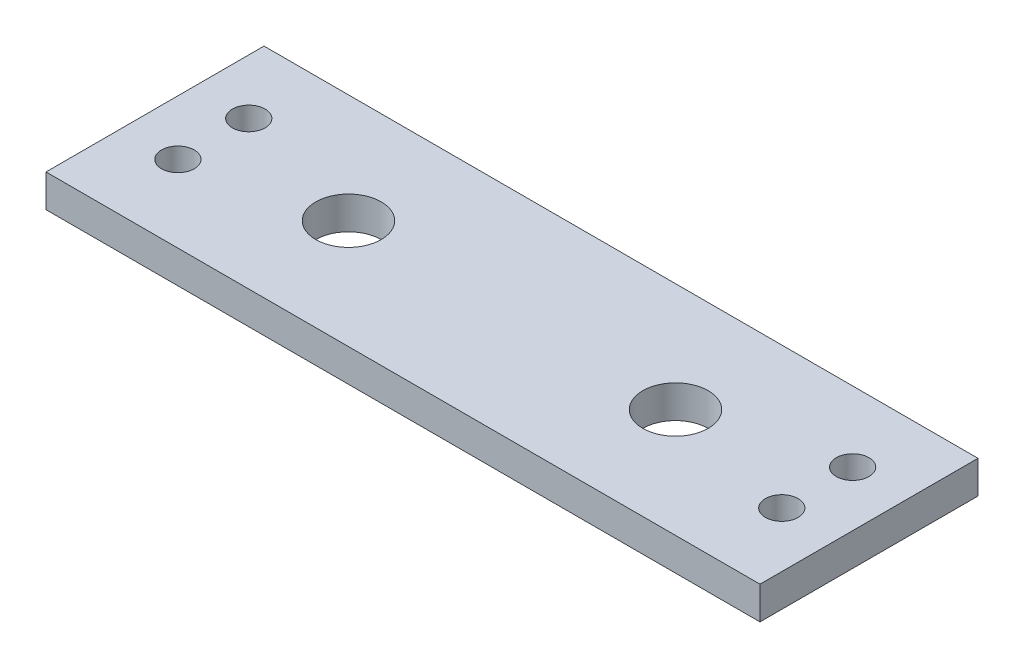
ISO-10303-21;
HEADER;
FILE_DESCRIPTION(('STEP AP214'),'2;1');
FILE_NAME('part.step','',(''),(''),'','','');
FILE_SCHEMA(('AUTOMOTIVE_DESIGN { 1 0 10303 214 1 1 1 1 }'));
ENDSEC;
DATA;
#1=APPLICATION_CONTEXT('core data for automotive mechanical design processes');
#2=APPLICATION_PROTOCOL_DEFINITION('international standard','automotive_design',2000,#1);
#3=PRODUCT_CONTEXT('',#1,'mechanical');
#4=PRODUCT('Part','Part','',(#3));
#5=PRODUCT_RELATED_PRODUCT_CATEGORY('part','',(#4));
#6=PRODUCT_DEFINITION_FORMATION('','',#4);
#7=PRODUCT_DEFINITION_CONTEXT('part definition',#1,'design');
#8=PRODUCT_DEFINITION('design','',#6,#7);
#9=PRODUCT_DEFINITION_SHAPE('','',#8);
#10=(LENGTH_UNIT() NAMED_UNIT(*) SI_UNIT(.MILLI.,.METRE.));
#11=(NAMED_UNIT(*) PLANE_ANGLE_UNIT() SI_UNIT($,.RADIAN.));
#12=(NAMED_UNIT(*) SI_UNIT($,.STERADIAN.) SOLID_ANGLE_UNIT());
#13=UNCERTAINTY_MEASURE_WITH_UNIT(LENGTH_MEASURE(1.E-05),#10,'distance_accuracy_value','');
#14=(GEOMETRIC_REPRESENTATION_CONTEXT(3) GLOBAL_UNCERTAINTY_ASSIGNED_CONTEXT((#13)) GLOBAL_UNIT_ASSIGNED_CONTEXT((#10,
#11,#12)) REPRESENTATION_CONTEXT('',''));
#15=CARTESIAN_POINT('',(0.,0.,0.));
#16=DIRECTION('',(0.,0.,1.));
#17=DIRECTION('',(1.,0.,0.));
#18=AXIS2_PLACEMENT_3D('',#15,#16,#17);
#19=CARTESIAN_POINT('',(0.,3.,0.));
#20=DIRECTION('',(1.,0.,0.));
#21=DIRECTION('',(0.,0.,-1.));
#22=AXIS2_PLACEMENT_3D('',#19,#20,#21);
#23=PLANE('',#22);
#24=DIRECTION('',(0.,0.,1.));
#25=VECTOR('',#24,1.);
#26=CARTESIAN_POINT('',(0.,0.,0.));
#27=LINE('',#26,#25);
#28=CARTESIAN_POINT('',(0.,0.,-20.));
#29=VERTEX_POINT('',#28);
#30=CARTESIAN_POINT('',(0.,0.,0.));
#31=VERTEX_POINT('',#30);
#32=EDGE_CURVE('E96',#29,#31,#27,.T.);
#33=ORIENTED_EDGE('',*,*,#32,.T.);
#34=DIRECTION('',(0.,-1.,0.));
#35=VECTOR('',#34,1.);
#36=CARTESIAN_POINT('',(0.,3.,0.));
#37=LINE('',#36,#35);
#38=CARTESIAN_POINT('',(0.,3.,0.));
#39=VERTEX_POINT('',#38);
#40=EDGE_CURVE('E11',#39,#31,#37,.T.);
#41=ORIENTED_EDGE('',*,*,#40,.F.);
#42=DIRECTION('',(0.,0.,1.));
#43=VECTOR('',#42,1.);
#44=CARTESIAN_POINT('',(0.,3.,0.));
#45=LINE('',#44,#43);
#46=CARTESIAN_POINT('',(0.,3.,-20.));
#47=VERTEX_POINT('',#46);
#48=EDGE_CURVE('E84',#47,#39,#45,.T.);
#49=ORIENTED_EDGE('',*,*,#48,.F.);
#50=DIRECTION('',(0.,-1.,0.));
#51=VECTOR('',#50,1.);
#52=CARTESIAN_POINT('',(0.,3.,-20.));
#53=LINE('',#52,#51);
#54=EDGE_CURVE('E92',#47,#29,#53,.T.);
#55=ORIENTED_EDGE('',*,*,#54,.T.);
#56=EDGE_LOOP('',(#33,#41,#49,#55));
#57=FACE_BOUND('',#56,.T.);
#58=ADVANCED_FACE('F33',(#57),#23,.F.);
#59=CARTESIAN_POINT('',(0.,3.,0.));
#60=DIRECTION('',(0.,0.,-1.));
#61=DIRECTION('',(-1.,0.,0.));
#62=AXIS2_PLACEMENT_3D('',#59,#60,#61);
#63=PLANE('',#62);
#64=DIRECTION('',(1.,0.,0.));
#65=VECTOR('',#64,1.);
#66=CARTESIAN_POINT('',(0.,0.,0.));
#67=LINE('',#66,#65);
#68=CARTESIAN_POINT('',(65.5,0.,0.));
#69=VERTEX_POINT('',#68);
#70=EDGE_CURVE('E88',#31,#69,#67,.T.);
#71=ORIENTED_EDGE('',*,*,#70,.T.);
#72=DIRECTION('',(0.,-1.,0.));
#73=VECTOR('',#72,1.);
#74=CARTESIAN_POINT('',(65.5,3.,0.));
#75=LINE('',#74,#73);
#76=CARTESIAN_POINT('',(65.5,3.,0.));
#77=VERTEX_POINT('',#76);
#78=EDGE_CURVE('E41',#77,#69,#75,.T.);
#79=ORIENTED_EDGE('',*,*,#78,.F.);
#80=DIRECTION('',(1.,0.,0.));
#81=VECTOR('',#80,1.);
#82=CARTESIAN_POINT('',(0.,3.,0.));
#83=LINE('',#82,#81);
#84=EDGE_CURVE('E79',#39,#77,#83,.T.);
#85=ORIENTED_EDGE('',*,*,#84,.F.);
#86=ORIENTED_EDGE('',*,*,#40,.T.);
#87=EDGE_LOOP('',(#71,#79,#85,#86));
#88=FACE_BOUND('',#87,.T.);
#89=ADVANCED_FACE('F87',(#88),#63,.F.);
#90=CARTESIAN_POINT('',(65.5,3.,0.));
#91=DIRECTION('',(-1.,0.,0.));
#92=DIRECTION('',(0.,0.,1.));
#93=AXIS2_PLACEMENT_3D('',#90,#91,#92);
#94=PLANE('',#93);
#95=DIRECTION('',(0.,0.,-1.));
#96=VECTOR('',#95,1.);
#97=CARTESIAN_POINT('',(65.5,0.,0.));
#98=LINE('',#97,#96);
#99=CARTESIAN_POINT('',(65.5,0.,-20.));
#100=VERTEX_POINT('',#99);
#101=EDGE_CURVE('E66',#69,#100,#98,.T.);
#102=ORIENTED_EDGE('',*,*,#101,.T.);
#103=DIRECTION('',(0.,-1.,0.));
#104=VECTOR('',#103,1.);
#105=CARTESIAN_POINT('',(65.5,3.,-20.));
#106=LINE('',#105,#104);
#107=CARTESIAN_POINT('',(65.5,3.,-20.));
#108=VERTEX_POINT('',#107);
#109=EDGE_CURVE('E89',#108,#100,#106,.T.);
#110=ORIENTED_EDGE('',*,*,#109,.F.);
#111=DIRECTION('',(0.,0.,-1.));
#112=VECTOR('',#111,1.);
#113=CARTESIAN_POINT('',(65.5,3.,0.));
#114=LINE('',#113,#112);
#115=EDGE_CURVE('E82',#77,#108,#114,.T.);
#116=ORIENTED_EDGE('',*,*,#115,.F.);
#117=ORIENTED_EDGE('',*,*,#78,.T.);
#118=EDGE_LOOP('',(#102,#110,#116,#117));
#119=FACE_BOUND('',#118,.T.);
#120=ADVANCED_FACE('F90',(#119),#94,.F.);
#121=CARTESIAN_POINT('',(0.,3.,-20.));
#122=DIRECTION('',(0.,0.,1.));
#123=DIRECTION('',(1.,0.,0.));
#124=AXIS2_PLACEMENT_3D('',#121,#122,#123);
#125=PLANE('',#124);
#126=DIRECTION('',(-1.,0.,0.));
#127=VECTOR('',#126,1.);
#128=CARTESIAN_POINT('',(0.,0.,-20.));
#129=LINE('',#128,#127);
#130=EDGE_CURVE('E72',#100,#29,#129,.T.);
#131=ORIENTED_EDGE('',*,*,#130,.T.);
#132=ORIENTED_EDGE('',*,*,#54,.F.);
#133=DIRECTION('',(-1.,0.,0.));
#134=VECTOR('',#133,1.);
#135=CARTESIAN_POINT('',(0.,3.,-20.));
#136=LINE('',#135,#134);
#137=EDGE_CURVE('E49',#108,#47,#136,.T.);
#138=ORIENTED_EDGE('',*,*,#137,.F.);
#139=ORIENTED_EDGE('',*,*,#109,.T.);
#140=EDGE_LOOP('',(#131,#132,#138,#139));
#141=FACE_BOUND('',#140,.T.);
#142=ADVANCED_FACE('F104',(#141),#125,.F.);
#143=CARTESIAN_POINT('',(0.,3.,0.));
#144=DIRECTION('',(0.,-1.,0.));
#145=DIRECTION('',(0.,0.,-1.));
#146=AXIS2_PLACEMENT_3D('',#143,#144,#145);
#147=PLANE('',#146);
#148=CARTESIAN_POINT('',(17.75,3.,-9.99999999999998));
#149=DIRECTION('',(0.,1.,0.));
#150=DIRECTION('',(0.,0.,1.));
#151=AXIS2_PLACEMENT_3D('',#148,#149,#150);
#152=CIRCLE('',#151,3.);
#153=CARTESIAN_POINT('',(17.75,3.,-6.99999999999998));
#154=VERTEX_POINT('',#153);
#155=EDGE_CURVE('E128',#154,#154,#152,.T.);
#156=ORIENTED_EDGE('',*,*,#155,.F.);
#157=EDGE_LOOP('',(#156));
#158=FACE_BOUND('',#157,.T.);
#159=CARTESIAN_POINT('',(5.05,3.,-7.05000000000012));
#160=DIRECTION('',(0.,1.,0.));
#161=DIRECTION('',(0.,0.,1.));
#162=AXIS2_PLACEMENT_3D('',#159,#160,#161);
#163=CIRCLE('',#162,1.5);
#164=CARTESIAN_POINT('',(5.05,3.,-5.55000000000012));
#165=VERTEX_POINT('',#164);
#166=EDGE_CURVE('E135',#165,#165,#163,.T.);
#167=ORIENTED_EDGE('',*,*,#166,.F.);
#168=EDGE_LOOP('',(#167));
#169=FACE_BOUND('',#168,.T.);
#170=CARTESIAN_POINT('',(5.05,3.,-13.5500000000001));
#171=DIRECTION('',(0.,1.,0.));
#172=DIRECTION('',(0.,0.,1.));
#173=AXIS2_PLACEMENT_3D('',#170,#171,#172);
#174=CIRCLE('',#173,1.5);
#175=CARTESIAN_POINT('',(5.05,3.,-12.0500000000001));
#176=VERTEX_POINT('',#175);
#177=EDGE_CURVE('E116',#176,#176,#174,.T.);
#178=ORIENTED_EDGE('',*,*,#177,.F.);
#179=EDGE_LOOP('',(#178));
#180=FACE_BOUND('',#179,.T.);
#181=CARTESIAN_POINT('',(60.45,3.,-7.05000000000012));
#182=DIRECTION('',(0.,1.,0.));
#183=DIRECTION('',(0.,0.,1.));
#184=AXIS2_PLACEMENT_3D('',#181,#182,#183);
#185=CIRCLE('',#184,1.50122028163598);
#186=CARTESIAN_POINT('',(60.45,3.,-5.54877971836414));
#187=VERTEX_POINT('',#186);
#188=EDGE_CURVE('E123',#187,#187,#185,.T.);
#189=ORIENTED_EDGE('',*,*,#188,.F.);
#190=EDGE_LOOP('',(#189));
#191=FACE_BOUND('',#190,.T.);
#192=CARTESIAN_POINT('',(47.75,3.,-9.99999999999998));
#193=DIRECTION('',(0.,1.,0.));
#194=DIRECTION('',(0.,0.,1.));
#195=AXIS2_PLACEMENT_3D('',#192,#193,#194);
#196=CIRCLE('',#195,3.);
#197=CARTESIAN_POINT('',(47.75,3.,-6.99999999999998));
#198=VERTEX_POINT('',#197);
#199=EDGE_CURVE('E140',#198,#198,#196,.T.);
#200=ORIENTED_EDGE('',*,*,#199,.F.);
#201=EDGE_LOOP('',(#200));
#202=FACE_BOUND('',#201,.T.);
#203=CARTESIAN_POINT('',(60.45,3.,-13.5500000000001));
#204=DIRECTION('',(0.,1.,0.));
#205=DIRECTION('',(0.,0.,1.));
#206=AXIS2_PLACEMENT_3D('',#203,#204,#205);
#207=CIRCLE('',#206,1.50170833238944);
#208=CARTESIAN_POINT('',(60.45,3.,-12.0482916676107));
#209=VERTEX_POINT('',#208);
#210=EDGE_CURVE('E110',#209,#209,#207,.T.);
#211=ORIENTED_EDGE('',*,*,#210,.F.);
#212=EDGE_LOOP('',(#211));
#213=FACE_BOUND('',#212,.T.);
#214=ORIENTED_EDGE('',*,*,#48,.T.);
#215=ORIENTED_EDGE('',*,*,#84,.T.);
#216=ORIENTED_EDGE('',*,*,#115,.T.);
#217=ORIENTED_EDGE('',*,*,#137,.T.);
#218=EDGE_LOOP('',(#214,#215,#216,#217));
#219=FACE_BOUND('',#218,.T.);
#220=ADVANCED_FACE('F80',(#158,#169,#180,#191,#202,#213,#219),#147,.F.);
#221=CARTESIAN_POINT('',(0.,0.,0.));
#222=DIRECTION('',(0.,-1.,0.));
#223=DIRECTION('',(0.,0.,-1.));
#224=AXIS2_PLACEMENT_3D('',#221,#222,#223);
#225=PLANE('',#224);
#226=CARTESIAN_POINT('',(17.75,0.,-9.99999999999998));
#227=DIRECTION('',(0.,1.,0.));
#228=DIRECTION('',(0.,0.,1.));
#229=AXIS2_PLACEMENT_3D('',#226,#227,#228);
#230=CIRCLE('',#229,3.);
#231=CARTESIAN_POINT('',(17.75,0.,-6.99999999999998));
#232=VERTEX_POINT('',#231);
#233=EDGE_CURVE('E131',#232,#232,#230,.T.);
#234=ORIENTED_EDGE('',*,*,#233,.T.);
#235=EDGE_LOOP('',(#234));
#236=FACE_BOUND('',#235,.T.);
#237=CARTESIAN_POINT('',(5.05,0.,-7.05000000000012));
#238=DIRECTION('',(0.,1.,0.));
#239=DIRECTION('',(0.,0.,1.));
#240=AXIS2_PLACEMENT_3D('',#237,#238,#239);
#241=CIRCLE('',#240,1.5);
#242=CARTESIAN_POINT('',(5.05,0.,-5.55000000000012));
#243=VERTEX_POINT('',#242);
#244=EDGE_CURVE('E120',#243,#243,#241,.T.);
#245=ORIENTED_EDGE('',*,*,#244,.T.);
#246=EDGE_LOOP('',(#245));
#247=FACE_BOUND('',#246,.T.);
#248=CARTESIAN_POINT('',(5.05,0.,-13.5500000000001));
#249=DIRECTION('',(0.,1.,0.));
#250=DIRECTION('',(0.,0.,1.));
#251=AXIS2_PLACEMENT_3D('',#248,#249,#250);
#252=CIRCLE('',#251,1.5);
#253=CARTESIAN_POINT('',(5.05,0.,-12.0500000000001));
#254=VERTEX_POINT('',#253);
#255=EDGE_CURVE('E119',#254,#254,#252,.T.);
#256=ORIENTED_EDGE('',*,*,#255,.T.);
#257=EDGE_LOOP('',(#256));
#258=FACE_BOUND('',#257,.T.);
#259=CARTESIAN_POINT('',(60.45,0.,-7.05000000000012));
#260=DIRECTION('',(0.,1.,0.));
#261=DIRECTION('',(0.,0.,1.));
#262=AXIS2_PLACEMENT_3D('',#259,#260,#261);
#263=CIRCLE('',#262,1.50122028163598);
#264=CARTESIAN_POINT('',(60.45,0.,-5.54877971836414));
#265=VERTEX_POINT('',#264);
#266=EDGE_CURVE('E113',#265,#265,#263,.T.);
#267=ORIENTED_EDGE('',*,*,#266,.T.);
#268=EDGE_LOOP('',(#267));
#269=FACE_BOUND('',#268,.T.);
#270=CARTESIAN_POINT('',(47.75,0.,-9.99999999999998));
#271=DIRECTION('',(0.,1.,0.));
#272=DIRECTION('',(0.,0.,1.));
#273=AXIS2_PLACEMENT_3D('',#270,#271,#272);
#274=CIRCLE('',#273,3.);
#275=CARTESIAN_POINT('',(47.75,0.,-6.99999999999998));
#276=VERTEX_POINT('',#275);
#277=EDGE_CURVE('E132',#276,#276,#274,.T.);
#278=ORIENTED_EDGE('',*,*,#277,.T.);
#279=EDGE_LOOP('',(#278));
#280=FACE_BOUND('',#279,.T.);
#281=CARTESIAN_POINT('',(60.45,0.,-13.5500000000001));
#282=DIRECTION('',(0.,1.,0.));
#283=DIRECTION('',(0.,0.,1.));
#284=AXIS2_PLACEMENT_3D('',#281,#282,#283);
#285=CIRCLE('',#284,1.50170833238944);
#286=CARTESIAN_POINT('',(60.45,0.,-12.0482916676107));
#287=VERTEX_POINT('',#286);
#288=EDGE_CURVE('E99',#287,#287,#285,.T.);
#289=ORIENTED_EDGE('',*,*,#288,.T.);
#290=EDGE_LOOP('',(#289));
#291=FACE_BOUND('',#290,.T.);
#292=ORIENTED_EDGE('',*,*,#32,.F.);
#293=ORIENTED_EDGE('',*,*,#130,.F.);
#294=ORIENTED_EDGE('',*,*,#101,.F.);
#295=ORIENTED_EDGE('',*,*,#70,.F.);
#296=EDGE_LOOP('',(#292,#293,#294,#295));
#297=FACE_BOUND('',#296,.T.);
#298=ADVANCED_FACE('F107',(#236,#247,#258,#269,#280,#291,#297),#225,.T.);
#299=CARTESIAN_POINT('',(60.45,0.,-13.5500000000001));
#300=DIRECTION('',(0.,1.,0.));
#301=DIRECTION('',(0.,0.,1.));
#302=AXIS2_PLACEMENT_3D('',#299,#300,#301);
#303=CYLINDRICAL_SURFACE('',#302,1.50170833238944);
#304=ORIENTED_EDGE('',*,*,#288,.F.);
#305=EDGE_LOOP('',(#304));
#306=FACE_BOUND('',#305,.T.);
#307=ORIENTED_EDGE('',*,*,#210,.T.);
#308=EDGE_LOOP('',(#307));
#309=FACE_BOUND('',#308,.T.);
#310=ADVANCED_FACE('F152',(#306,#309),#303,.F.);
#311=CARTESIAN_POINT('',(47.75,0.,-9.99999999999998));
#312=DIRECTION('',(0.,1.,0.));
#313=DIRECTION('',(0.,0.,1.));
#314=AXIS2_PLACEMENT_3D('',#311,#312,#313);
#315=CYLINDRICAL_SURFACE('',#314,3.);
#316=ORIENTED_EDGE('',*,*,#277,.F.);
#317=EDGE_LOOP('',(#316));
#318=FACE_BOUND('',#317,.T.);
#319=ORIENTED_EDGE('',*,*,#199,.T.);
#320=EDGE_LOOP('',(#319));
#321=FACE_BOUND('',#320,.T.);
#322=ADVANCED_FACE('F148',(#318,#321),#315,.F.);
#323=CARTESIAN_POINT('',(60.45,0.,-7.05000000000012));
#324=DIRECTION('',(0.,1.,0.));
#325=DIRECTION('',(0.,0.,1.));
#326=AXIS2_PLACEMENT_3D('',#323,#324,#325);
#327=CYLINDRICAL_SURFACE('',#326,1.50122028163598);
#328=ORIENTED_EDGE('',*,*,#266,.F.);
#329=EDGE_LOOP('',(#328));
#330=FACE_BOUND('',#329,.T.);
#331=ORIENTED_EDGE('',*,*,#188,.T.);
#332=EDGE_LOOP('',(#331));
#333=FACE_BOUND('',#332,.T.);
#334=ADVANCED_FACE('F151',(#330,#333),#327,.F.);
#335=CARTESIAN_POINT('',(5.05,0.,-13.5500000000001));
#336=DIRECTION('',(0.,1.,0.));
#337=DIRECTION('',(0.,0.,1.));
#338=AXIS2_PLACEMENT_3D('',#335,#336,#337);
#339=CYLINDRICAL_SURFACE('',#338,1.5);
#340=ORIENTED_EDGE('',*,*,#255,.F.);
#341=EDGE_LOOP('',(#340));
#342=FACE_BOUND('',#341,.T.);
#343=ORIENTED_EDGE('',*,*,#177,.T.);
#344=EDGE_LOOP('',(#343));
#345=FACE_BOUND('',#344,.T.);
#346=ADVANCED_FACE('F215',(#342,#345),#339,.F.);
#347=CARTESIAN_POINT('',(5.05,0.,-7.05000000000012));
#348=DIRECTION('',(0.,1.,0.));
#349=DIRECTION('',(0.,0.,1.));
#350=AXIS2_PLACEMENT_3D('',#347,#348,#349);
#351=CYLINDRICAL_SURFACE('',#350,1.5);
#352=ORIENTED_EDGE('',*,*,#244,.F.);
#353=EDGE_LOOP('',(#352));
#354=FACE_BOUND('',#353,.T.);
#355=ORIENTED_EDGE('',*,*,#166,.T.);
#356=EDGE_LOOP('',(#355));
#357=FACE_BOUND('',#356,.T.);
#358=ADVANCED_FACE('F225',(#354,#357),#351,.F.);
#359=CARTESIAN_POINT('',(17.75,0.,-9.99999999999998));
#360=DIRECTION('',(0.,1.,0.));
#361=DIRECTION('',(0.,0.,1.));
#362=AXIS2_PLACEMENT_3D('',#359,#360,#361);
#363=CYLINDRICAL_SURFACE('',#362,3.);
#364=ORIENTED_EDGE('',*,*,#233,.F.);
#365=EDGE_LOOP('',(#364));
#366=FACE_BOUND('',#365,.T.);
#367=ORIENTED_EDGE('',*,*,#155,.T.);
#368=EDGE_LOOP('',(#367));
#369=FACE_BOUND('',#368,.T.);
#370=ADVANCED_FACE('F234',(#366,#369),#363,.F.);
#371=CLOSED_SHELL('',(#58,#89,#120,#142,#220,#298,#310,#322,#334,#346,#358,#370));
#372=MANIFOLD_SOLID_BREP('B2',#371);
#373=ADVANCED_BREP_SHAPE_REPRESENTATION('',(#18,#372),#14);
#374=SHAPE_DEFINITION_REPRESENTATION(#9,#373);
ENDSEC;
END-ISO-10303-21;
